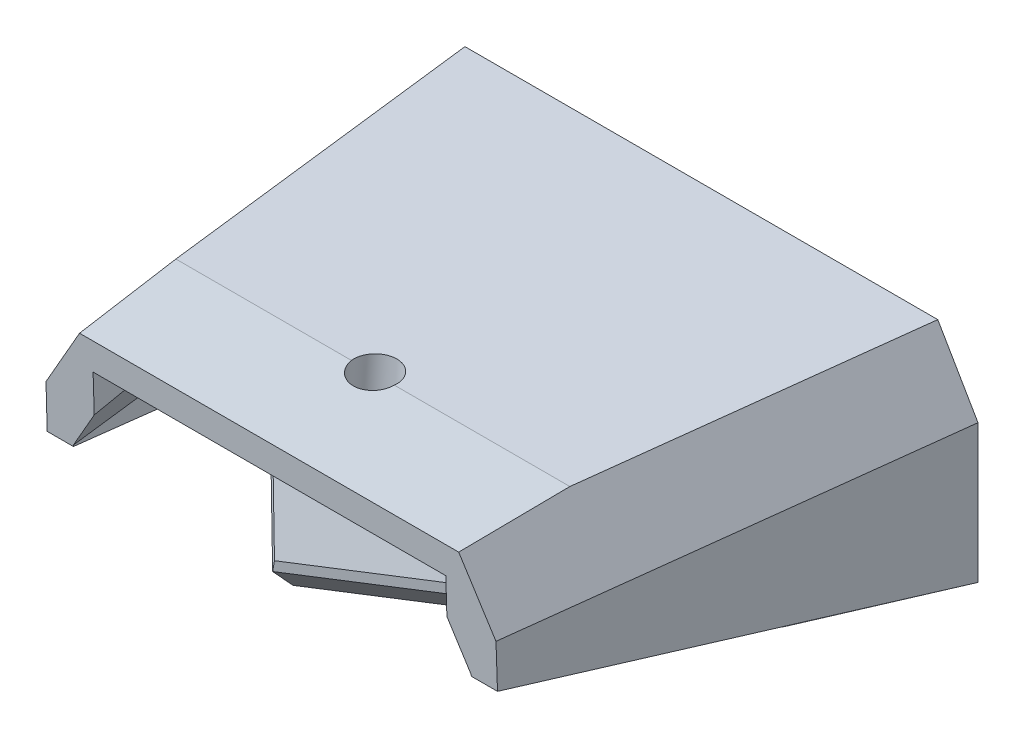
ISO-10303-21;
HEADER;
FILE_DESCRIPTION(('STEP AP214'),'2;1');
FILE_NAME('part.step','',(''),(''),'','','');
FILE_SCHEMA(('AUTOMOTIVE_DESIGN { 1 0 10303 214 1 1 1 1 }'));
ENDSEC;
DATA;
#1=APPLICATION_CONTEXT('core data for automotive mechanical design processes');
#2=APPLICATION_PROTOCOL_DEFINITION('international standard','automotive_design',2000,#1);
#3=PRODUCT_CONTEXT('',#1,'mechanical');
#4=PRODUCT('Part','Part','',(#3));
#5=PRODUCT_RELATED_PRODUCT_CATEGORY('part','',(#4));
#6=PRODUCT_DEFINITION_FORMATION('','',#4);
#7=PRODUCT_DEFINITION_CONTEXT('part definition',#1,'design');
#8=PRODUCT_DEFINITION('design','',#6,#7);
#9=PRODUCT_DEFINITION_SHAPE('','',#8);
#10=(LENGTH_UNIT() NAMED_UNIT(*) SI_UNIT(.MILLI.,.METRE.));
#11=(NAMED_UNIT(*) PLANE_ANGLE_UNIT() SI_UNIT($,.RADIAN.));
#12=(NAMED_UNIT(*) SI_UNIT($,.STERADIAN.) SOLID_ANGLE_UNIT());
#13=UNCERTAINTY_MEASURE_WITH_UNIT(LENGTH_MEASURE(1.E-05),#10,'distance_accuracy_value','');
#14=(GEOMETRIC_REPRESENTATION_CONTEXT(3) GLOBAL_UNCERTAINTY_ASSIGNED_CONTEXT((#13)) GLOBAL_UNIT_ASSIGNED_CONTEXT((#10,
#11,#12)) REPRESENTATION_CONTEXT('',''));
#15=CARTESIAN_POINT('',(0.,0.,0.));
#16=DIRECTION('',(0.,0.,1.));
#17=DIRECTION('',(1.,0.,0.));
#18=AXIS2_PLACEMENT_3D('',#15,#16,#17);
#19=CARTESIAN_POINT('',(0.,0.,0.));
#20=DIRECTION('',(0.,1.,0.));
#21=DIRECTION('',(0.,0.,1.));
#22=AXIS2_PLACEMENT_3D('',#19,#20,#21);
#23=PLANE('',#22);
#24=DIRECTION('',(-0.119145220618431,0.,-0.992876838486922));
#25=VECTOR('',#24,1.);
#26=CARTESIAN_POINT('',(0.502534808185643,0.,-25.2382904412369));
#27=LINE('',#26,#25);
#28=CARTESIAN_POINT('',(2.76887033886593,0.,-6.35216101890115));
#29=VERTEX_POINT('',#28);
#30=CARTESIAN_POINT('',(2.53112966113409,0.,-8.33333333333314));
#31=VERTEX_POINT('',#30);
#32=EDGE_CURVE('E489',#29,#31,#27,.T.);
#33=ORIENTED_EDGE('',*,*,#32,.T.);
#34=DIRECTION('',(1.,0.,0.));
#35=VECTOR('',#34,1.);
#36=CARTESIAN_POINT('',(-17.3629163817419,0.,-8.33333333333314));
#37=LINE('',#36,#35);
#38=CARTESIAN_POINT('',(2.76887033886593,0.,-8.33333333333314));
#39=VERTEX_POINT('',#38);
#40=EDGE_CURVE('E314',#31,#39,#37,.T.);
#41=ORIENTED_EDGE('',*,*,#40,.T.);
#42=DIRECTION('',(0.,0.,-1.));
#43=VECTOR('',#42,1.);
#44=CARTESIAN_POINT('',(2.76887033886593,0.,0.));
#45=LINE('',#44,#43);
#46=EDGE_CURVE('E338',#29,#39,#45,.T.);
#47=ORIENTED_EDGE('',*,*,#46,.F.);
#48=EDGE_LOOP('',(#33,#41,#47));
#49=FACE_BOUND('',#48,.T.);
#50=ADVANCED_FACE('F78',(#49),#23,.F.);
#51=CARTESIAN_POINT('',(1.5167811312118,-3.46410161513779,0.));
#52=DIRECTION('',(0.859856564958856,-0.499999999999995,-0.103182787795063));
#53=DIRECTION('',(-0.119145220618431,0.,-0.992876838486922));
#54=AXIS2_PLACEMENT_3D('',#51,#52,#53);
#55=PLANE('',#54);
#56=DIRECTION('',(0.,-0.202106905399812,0.979363466129767));
#57=VECTOR('',#56,1.);
#58=CARTESIAN_POINT('',(2.76887033886593,-1.39882095757878,0.426202831652322));
#59=LINE('',#58,#57);
#60=CARTESIAN_POINT('',(2.76887033886593,-1.2867578238557,-0.116829277276788));
#61=VERTEX_POINT('',#60);
#62=EDGE_CURVE('E474',#61,#29,#59,.F.);
#63=ORIENTED_EDGE('',*,*,#62,.F.);
#64=DIRECTION('',(0.504890138740269,0.862773094436703,0.0266183267495743));
#65=VECTOR('',#64,1.);
#66=CARTESIAN_POINT('',(1.50280210436019,-3.45025741443586,-0.183577695135405));
#67=LINE('',#66,#65);
#68=CARTESIAN_POINT('',(1.49470055314328,-3.46410161513779,-0.184004817237667));
#69=VERTEX_POINT('',#68);
#70=EDGE_CURVE('E915',#61,#69,#67,.F.);
#71=ORIENTED_EDGE('',*,*,#70,.T.);
#72=DIRECTION('',(0.119145220618431,0.,0.992876838486922));
#73=VECTOR('',#72,1.);
#74=CARTESIAN_POINT('',(1.5167811312118,-3.46410161513779,0.));
#75=LINE('',#74,#73);
#76=CARTESIAN_POINT('',(-1.4832188687882,-3.46410161513779,-25.));
#77=VERTEX_POINT('',#76);
#78=EDGE_CURVE('E411',#77,#69,#75,.T.);
#79=ORIENTED_EDGE('',*,*,#78,.F.);
#80=DIRECTION('',(0.502683115756314,0.864470754354087,0.));
#81=VECTOR('',#80,1.);
#82=CARTESIAN_POINT('',(4.98555698992813,7.66033716359151,-25.));
#83=LINE('',#82,#81);
#84=CARTESIAN_POINT('',(1.40336816062832,1.5,-25.));
#85=VERTEX_POINT('',#84);
#86=EDGE_CURVE('E496',#85,#77,#83,.F.);
#87=ORIENTED_EDGE('',*,*,#86,.F.);
#88=DIRECTION('',(-0.0672407716782115,0.0894348295025887,-0.993720327806552));
#89=VECTOR('',#88,1.);
#90=CARTESIAN_POINT('',(1.31851975718103,1.6128541851392,-26.2539353904355));
#91=LINE('',#90,#89);
#92=EDGE_CURVE('E311',#85,#31,#91,.F.);
#93=ORIENTED_EDGE('',*,*,#92,.T.);
#94=ORIENTED_EDGE('',*,*,#32,.F.);
#95=EDGE_LOOP('',(#63,#71,#79,#87,#93,#94));
#96=FACE_BOUND('',#95,.T.);
#97=ADVANCED_FACE('F606',(#96),#55,.T.);
#98=CARTESIAN_POINT('',(0.,-3.33842045020984,0.734452499046166));
#99=DIRECTION('',(0.,0.97664446670509,-0.21486178267512));
#100=DIRECTION('',(0.,0.21486178267512,0.97664446670509));
#101=AXIS2_PLACEMENT_3D('',#98,#99,#100);
#102=PLANE('',#101);
#103=DIRECTION('',(-0.114039713010586,-0.21346006563523,-0.97027302561468));
#104=VECTOR('',#103,1.);
#105=CARTESIAN_POINT('',(-3.,-9.,-25.));
#106=LINE('',#105,#104);
#107=CARTESIAN_POINT('',(-1.81620359026515,-6.78416437002702,-14.9280198637592));
#108=VERTEX_POINT('',#107);
#109=CARTESIAN_POINT('',(-3.,-9.,-25.));
#110=VERTEX_POINT('',#109);
#111=EDGE_CURVE('E383',#108,#110,#106,.T.);
#112=ORIENTED_EDGE('',*,*,#111,.F.);
#113=DIRECTION('',(-0.703496414382695,-0.152702012719811,-0.694100057817323));
#114=VECTOR('',#113,1.);
#115=CARTESIAN_POINT('',(7.10074552097474,-4.84863769388713,-6.13017133585061));
#116=LINE('',#115,#114);
#117=CARTESIAN_POINT('',(-1.78802626747906,-6.77804815704494,-14.9002188956588));
#118=VERTEX_POINT('',#117);
#119=EDGE_CURVE('E347',#118,#108,#116,.T.);
#120=ORIENTED_EDGE('',*,*,#119,.F.);
#121=DIRECTION('',(-0.116400668141753,-0.213401224926547,-0.970005567847939));
#122=VECTOR('',#121,1.);
#123=CARTESIAN_POINT('',(-2.70191945803538,-8.4535190063982,-22.5159954836281));
#124=LINE('',#123,#122);
#125=EDGE_CURVE('E396',#118,#110,#124,.T.);
#126=ORIENTED_EDGE('',*,*,#125,.T.);
#127=EDGE_LOOP('',(#112,#120,#126));
#128=FACE_BOUND('',#127,.T.);
#129=ADVANCED_FACE('F582',(#128),#102,.T.);
#130=DIRECTION('',(0.699841488267646,-0.153475380519136,-0.697615365996072));
#131=VECTOR('',#130,1.);
#132=CARTESIAN_POINT('',(6.09842939222965,-2.05462061566197,6.5699062924456));
#133=LINE('',#132,#131);
#134=CARTESIAN_POINT('',(27.8085372830385,-6.81565168557063,-15.0711440253211));
#135=VERTEX_POINT('',#134);
#136=CARTESIAN_POINT('',(27.836275268888,-6.82173463150118,-15.0987937795508));
#137=VERTEX_POINT('',#136);
#138=EDGE_CURVE('E345',#135,#137,#133,.T.);
#139=ORIENTED_EDGE('',*,*,#138,.T.);
#140=DIRECTION('',(-0.114039713010586,0.21346006563523,0.97027302561468));
#141=VECTOR('',#140,1.);
#142=CARTESIAN_POINT('',(26.,-3.38458603586418,0.524608927890113));
#143=LINE('',#142,#141);
#144=CARTESIAN_POINT('',(29.,-9.,-25.));
#145=VERTEX_POINT('',#144);
#146=EDGE_CURVE('E375',#145,#137,#143,.T.);
#147=ORIENTED_EDGE('',*,*,#146,.F.);
#148=DIRECTION('',(-0.116400668141753,0.213401224926547,0.970005567847939));
#149=VECTOR('',#148,1.);
#150=CARTESIAN_POINT('',(28.7019194580354,-8.4535190063982,-22.5159954836282));
#151=LINE('',#150,#149);
#152=EDGE_CURVE('E393',#145,#135,#151,.T.);
#153=ORIENTED_EDGE('',*,*,#152,.T.);
#154=EDGE_LOOP('',(#139,#147,#153));
#155=FACE_BOUND('',#154,.T.);
#156=ADVANCED_FACE('F531',(#155),#102,.T.);
#157=CARTESIAN_POINT('',(13.,-3.56813645169676,-0.309711144076167));
#158=VERTEX_POINT('',#157);
#159=CARTESIAN_POINT('',(24.3245404404983,-6.05161047038072,-11.5982294108215));
#160=VERTEX_POINT('',#159);
#161=EDGE_CURVE('E348',#158,#160,#133,.T.);
#162=ORIENTED_EDGE('',*,*,#161,.T.);
#163=DIRECTION('',(0.116400668141753,-0.213401224926547,-0.970005567847939));
#164=VECTOR('',#163,1.);
#165=CARTESIAN_POINT('',(22.5350942341944,-2.77095909215688,3.31382230837784));
#166=LINE('',#165,#164);
#167=CARTESIAN_POINT('',(25.7421778869917,-8.65061245561866,-23.4118747982666));
#168=VERTEX_POINT('',#167);
#169=EDGE_CURVE('E421',#160,#168,#166,.T.);
#170=ORIENTED_EDGE('',*,*,#169,.T.);
#171=DIRECTION('',(-0.699841488267646,0.153475380519136,0.697615365996072));
#172=VECTOR('',#171,1.);
#173=CARTESIAN_POINT('',(0.774924275915627,-3.17528866770938,1.47596060132098));
#174=LINE('',#173,#172);
#175=CARTESIAN_POINT('',(13.,-5.85625025698794,-10.7102284408543));
#176=VERTEX_POINT('',#175);
#177=EDGE_CURVE('E365',#168,#176,#174,.T.);
#178=ORIENTED_EDGE('',*,*,#177,.T.);
#179=DIRECTION('',(0.703496414382695,0.152702012719811,0.694100057817323));
#180=VECTOR('',#179,1.);
#181=CARTESIAN_POINT('',(12.4250872492295,-5.98104170209853,-11.277462282266));
#182=LINE('',#181,#180);
#183=CARTESIAN_POINT('',(-1.4832188687882,-9.,-25.));
#184=VERTEX_POINT('',#183);
#185=EDGE_CURVE('E362',#184,#176,#182,.T.);
#186=ORIENTED_EDGE('',*,*,#185,.F.);
#187=DIRECTION('',(0.116400668141753,0.213401224926547,0.970005567847939));
#188=VECTOR('',#187,1.);
#189=CARTESIAN_POINT('',(1.29322072473834,-3.90986074520135,-1.86300338727889));
#190=LINE('',#189,#188);
#191=CARTESIAN_POINT('',(-0.0675449642143444,-6.4045978416146,-13.2027174618846));
#192=VERTEX_POINT('',#191);
#193=EDGE_CURVE('E390',#184,#192,#190,.T.);
#194=ORIENTED_EDGE('',*,*,#193,.T.);
#195=EDGE_CURVE('E342',#158,#192,#116,.T.);
#196=ORIENTED_EDGE('',*,*,#195,.F.);
#197=EDGE_LOOP('',(#162,#170,#178,#186,#194,#196));
#198=FACE_BOUND('',#197,.T.);
#199=ADVANCED_FACE('F559',(#198),#102,.T.);
#200=CARTESIAN_POINT('',(29.,-10.4649667000576,-24.6777073259873));
#201=DIRECTION('',(0.,0.21486178267512,0.97664446670509));
#202=DIRECTION('',(0.,-0.97664446670509,0.21486178267512));
#203=AXIS2_PLACEMENT_3D('',#200,#201,#202);
#204=PLANE('',#203);
#205=DIRECTION('',(0.,-0.97664446670509,0.21486178267512));
#206=VECTOR('',#205,1.);
#207=CARTESIAN_POINT('',(-1.4832188687882,-9.,-25.));
#208=LINE('',#207,#206);
#209=CARTESIAN_POINT('',(-1.4832188687882,-9.84968166692628,-24.8130700332762));
#210=VERTEX_POINT('',#209);
#211=EDGE_CURVE('E368',#184,#210,#208,.T.);
#212=ORIENTED_EDGE('',*,*,#211,.T.);
#213=DIRECTION('',(0.867436684678202,-0.485927094571341,0.106903960805695));
#214=VECTOR('',#213,1.);
#215=CARTESIAN_POINT('',(1.86520211081921,-11.7254248845721,-24.4004065253941));
#216=LINE('',#215,#214);
#217=EDGE_CURVE('E446',#210,#110,#216,.F.);
#218=ORIENTED_EDGE('',*,*,#217,.T.);
#219=DIRECTION('',(1.,0.,0.));
#220=VECTOR('',#219,1.);
#221=CARTESIAN_POINT('',(-3.,-9.,-25.));
#222=LINE('',#221,#220);
#223=EDGE_CURVE('E387',#110,#184,#222,.T.);
#224=ORIENTED_EDGE('',*,*,#223,.T.);
#225=EDGE_LOOP('',(#212,#218,#224));
#226=FACE_BOUND('',#225,.T.);
#227=ADVANCED_FACE('F633',(#226),#204,.F.);
#228=CARTESIAN_POINT('',(0.,-4.80338715026748,1.05674517305885));
#229=DIRECTION('',(0.,0.97664446670509,-0.21486178267512));
#230=DIRECTION('',(0.,0.21486178267512,0.97664446670509));
#231=AXIS2_PLACEMENT_3D('',#228,#229,#230);
#232=PLANE('',#231);
#233=DIRECTION('',(-0.699841488267646,0.153475380519136,0.697615365996071));
#234=VECTOR('',#233,1.);
#235=CARTESIAN_POINT('',(5.38413121128605,-3.6699565054788,6.20870264937103));
#236=LINE('',#235,#234);
#237=CARTESIAN_POINT('',(25.0598770441155,-7.98485156288133,-13.4044567024586));
#238=VERTEX_POINT('',#237);
#239=CARTESIAN_POINT('',(12.9963446451858,-5.33931645761962,-1.37929713308725));
#240=VERTEX_POINT('',#239);
#241=EDGE_CURVE('E457',#238,#240,#236,.T.);
#242=ORIENTED_EDGE('',*,*,#241,.T.);
#243=DIRECTION('',(-0.703496414382695,-0.152702012719811,-0.694100057817323));
#244=VECTOR('',#243,1.);
#245=CARTESIAN_POINT('',(1.85267361861976,-7.75817881434855,-12.3741260273096));
#246=LINE('',#245,#244);
#247=CARTESIAN_POINT('',(0.957402435166903,-7.95250775312965,-13.2574393854056));
#248=VERTEX_POINT('',#247);
#249=EDGE_CURVE('E459',#240,#248,#246,.T.);
#250=ORIENTED_EDGE('',*,*,#249,.T.);
#251=DIRECTION('',(-0.114039713010586,-0.21346006563523,-0.970273025614681));
#252=VECTOR('',#251,1.);
#253=CARTESIAN_POINT('',(2.60546978532506,-4.86764761582482,0.764652147798188));
#254=LINE('',#253,#252);
#255=CARTESIAN_POINT('',(-0.24078592089493,-10.1952822952278,-23.4518691222154));
#256=VERTEX_POINT('',#255);
#257=EDGE_CURVE('E442',#248,#256,#254,.T.);
#258=ORIENTED_EDGE('',*,*,#257,.T.);
#259=DIRECTION('',(0.703496414382695,0.152702012719811,0.694100057817323));
#260=VECTOR('',#259,1.);
#261=CARTESIAN_POINT('',(12.4250872492295,-7.44600840215616,-10.9551696082534));
#262=LINE('',#261,#260);
#263=CARTESIAN_POINT('',(13.,-7.32121695704558,-10.3879357668416));
#264=VERTEX_POINT('',#263);
#265=EDGE_CURVE('E361',#256,#264,#262,.T.);
#266=ORIENTED_EDGE('',*,*,#265,.T.);
#267=DIRECTION('',(-0.699841488267646,0.153475380519136,0.697615365996072));
#268=VECTOR('',#267,1.);
#269=CARTESIAN_POINT('',(0.774924275915627,-4.64025536776702,1.79825327533366));
#270=LINE('',#269,#268);
#271=CARTESIAN_POINT('',(26.2587233633781,-10.2288576835613,-23.6044845237314));
#272=VERTEX_POINT('',#271);
#273=EDGE_CURVE('E366',#272,#264,#270,.T.);
#274=ORIENTED_EDGE('',*,*,#273,.F.);
#275=DIRECTION('',(-0.114039713010586,0.21346006563523,0.970273025614681));
#276=VECTOR('',#275,1.);
#277=CARTESIAN_POINT('',(23.056398754943,-4.234731575594,3.64154323975649));
#278=LINE('',#277,#276);
#279=EDGE_CURVE('E439',#272,#238,#278,.T.);
#280=ORIENTED_EDGE('',*,*,#279,.T.);
#281=EDGE_LOOP('',(#242,#250,#258,#266,#274,#280));
#282=FACE_BOUND('',#281,.T.);
#283=ADVANCED_FACE('F593',(#282),#232,.F.);
#284=CARTESIAN_POINT('',(-3.,3.,-25.));
#285=DIRECTION('',(0.992876838486922,0.,-0.119145220618431));
#286=DIRECTION('',(-0.119145220618431,0.,-0.992876838486922));
#287=AXIS2_PLACEMENT_3D('',#284,#285,#286);
#288=PLANE('',#287);
#289=CARTESIAN_POINT('',(-0.0223652860903739,-3.54100302449902,-0.186377384086446));
#290=VERTEX_POINT('',#289);
#291=EDGE_CURVE('E397',#290,#118,#124,.T.);
#292=ORIENTED_EDGE('',*,*,#291,.F.);
#293=DIRECTION('',(0.00370046105626031,0.999517571229778,0.0308371754688359));
#294=VECTOR('',#293,1.);
#295=CARTESIAN_POINT('',(-0.00104453648508288,2.21786419185145,-0.00870447070901864));
#296=LINE('',#295,#294);
#297=CARTESIAN_POINT('',(-0.0129578649437614,-1.00000000000002,-0.107982207864673));
#298=VERTEX_POINT('',#297);
#299=EDGE_CURVE('E300',#290,#298,#296,.T.);
#300=ORIENTED_EDGE('',*,*,#299,.T.);
#301=DIRECTION('',(-0.119145220618431,0.,-0.992876838486922));
#302=VECTOR('',#301,1.);
#303=CARTESIAN_POINT('',(-3.,-1.00000000000002,-25.));
#304=LINE('',#303,#302);
#305=CARTESIAN_POINT('',(-3.,-1.00000000000002,-25.));
#306=VERTEX_POINT('',#305);
#307=EDGE_CURVE('E299',#298,#306,#304,.T.);
#308=ORIENTED_EDGE('',*,*,#307,.T.);
#309=DIRECTION('',(0.,-1.,0.));
#310=VECTOR('',#309,1.);
#311=CARTESIAN_POINT('',(-3.,3.,-25.));
#312=LINE('',#311,#310);
#313=EDGE_CURVE('E406',#306,#110,#312,.T.);
#314=ORIENTED_EDGE('',*,*,#313,.T.);
#315=ORIENTED_EDGE('',*,*,#125,.F.);
#316=EDGE_LOOP('',(#292,#300,#308,#314,#315));
#317=FACE_BOUND('',#316,.T.);
#318=ADVANCED_FACE('F638',(#317),#288,.F.);
#319=CARTESIAN_POINT('',(29.,3.,-25.));
#320=DIRECTION('',(-0.992876838486922,0.,-0.119145220618431));
#321=DIRECTION('',(-0.119145220618431,0.,0.992876838486922));
#322=AXIS2_PLACEMENT_3D('',#319,#320,#321);
#323=PLANE('',#322);
#324=DIRECTION('',(-0.119145220618431,0.,0.992876838486922));
#325=VECTOR('',#324,1.);
#326=CARTESIAN_POINT('',(26.,-1.00000000000002,0.));
#327=LINE('',#326,#325);
#328=CARTESIAN_POINT('',(29.,-1.00000000000002,-25.));
#329=VERTEX_POINT('',#328);
#330=CARTESIAN_POINT('',(26.0129578649438,-1.00000000000002,-0.107982207864673));
#331=VERTEX_POINT('',#330);
#332=EDGE_CURVE('E508',#329,#331,#327,.T.);
#333=ORIENTED_EDGE('',*,*,#332,.T.);
#334=DIRECTION('',(0.00370046105626031,-0.999517571229778,-0.0308371754688359));
#335=VECTOR('',#334,1.);
#336=CARTESIAN_POINT('',(26.0010445364851,2.21786419185145,-0.00870447070901864));
#337=LINE('',#336,#335);
#338=CARTESIAN_POINT('',(26.0223652860904,-3.54100302449902,-0.186377384086444));
#339=VERTEX_POINT('',#338);
#340=EDGE_CURVE('E918',#331,#339,#337,.T.);
#341=ORIENTED_EDGE('',*,*,#340,.T.);
#342=DIRECTION('',(-0.116400668141753,0.213401224926547,0.970005567847939));
#343=VECTOR('',#342,1.);
#344=CARTESIAN_POINT('',(28.7019194580354,-8.45351900639819,-22.5159954836282));
#345=LINE('',#344,#343);
#346=EDGE_CURVE('E355',#135,#339,#345,.T.);
#347=ORIENTED_EDGE('',*,*,#346,.F.);
#348=ORIENTED_EDGE('',*,*,#152,.F.);
#349=DIRECTION('',(0.,-1.,0.));
#350=VECTOR('',#349,1.);
#351=CARTESIAN_POINT('',(29.,3.,-25.));
#352=LINE('',#351,#350);
#353=EDGE_CURVE('E409',#329,#145,#352,.T.);
#354=ORIENTED_EDGE('',*,*,#353,.F.);
#355=EDGE_LOOP('',(#333,#341,#347,#348,#354));
#356=FACE_BOUND('',#355,.T.);
#357=ADVANCED_FACE('F718',(#356),#323,.F.);
#358=CARTESIAN_POINT('',(13.,3.,-25.));
#359=DIRECTION('',(0.,0.,1.));
#360=DIRECTION('',(1.,0.,0.));
#361=AXIS2_PLACEMENT_3D('',#358,#359,#360);
#362=PLANE('',#361);
#363=DIRECTION('',(1.,0.,0.));
#364=VECTOR('',#363,1.);
#365=CARTESIAN_POINT('',(-17.3629163817419,1.5,-25.));
#366=LINE('',#365,#364);
#367=CARTESIAN_POINT('',(24.5966318393717,1.5,-25.));
#368=VERTEX_POINT('',#367);
#369=EDGE_CURVE('E317',#85,#368,#366,.T.);
#370=ORIENTED_EDGE('',*,*,#369,.F.);
#371=ORIENTED_EDGE('',*,*,#86,.T.);
#372=DIRECTION('',(0.,1.,0.));
#373=VECTOR('',#372,1.);
#374=CARTESIAN_POINT('',(-1.4832188687882,-12.5,-25.));
#375=LINE('',#374,#373);
#376=EDGE_CURVE('E402',#184,#77,#375,.T.);
#377=ORIENTED_EDGE('',*,*,#376,.F.);
#378=ORIENTED_EDGE('',*,*,#223,.F.);
#379=ORIENTED_EDGE('',*,*,#313,.F.);
#380=DIRECTION('',(0.502683115756316,0.864470754354086,0.));
#381=VECTOR('',#380,1.);
#382=CARTESIAN_POINT('',(0.0756968234203663,4.28931621088221,-25.));
#383=LINE('',#382,#381);
#384=CARTESIAN_POINT('',(-0.674030668015314,3.,-25.));
#385=VERTEX_POINT('',#384);
#386=EDGE_CURVE('E504',#306,#385,#383,.T.);
#387=ORIENTED_EDGE('',*,*,#386,.T.);
#388=DIRECTION('',(-1.,0.,0.));
#389=VECTOR('',#388,1.);
#390=CARTESIAN_POINT('',(13.,3.,-25.));
#391=LINE('',#390,#389);
#392=CARTESIAN_POINT('',(26.6740306680153,3.,-25.));
#393=VERTEX_POINT('',#392);
#394=EDGE_CURVE('E403',#393,#385,#391,.T.);
#395=ORIENTED_EDGE('',*,*,#394,.F.);
#396=DIRECTION('',(0.502683115756315,-0.864470754354087,0.));
#397=VECTOR('',#396,1.);
#398=CARTESIAN_POINT('',(25.831038927875,4.44970396393153,-25.));
#399=LINE('',#398,#397);
#400=EDGE_CURVE('E506',#393,#329,#399,.T.);
#401=ORIENTED_EDGE('',*,*,#400,.T.);
#402=ORIENTED_EDGE('',*,*,#353,.T.);
#403=CARTESIAN_POINT('',(27.3353708682695,-9.,-25.));
#404=VERTEX_POINT('',#403);
#405=EDGE_CURVE('E386',#404,#145,#222,.T.);
#406=ORIENTED_EDGE('',*,*,#405,.F.);
#407=DIRECTION('',(-0.205998183289691,0.978552373908186,0.));
#408=VECTOR('',#407,1.);
#409=CARTESIAN_POINT('',(24.3080856645145,5.38050120308915,-25.));
#410=LINE('',#409,#408);
#411=CARTESIAN_POINT('',(27.0934154004732,-7.85063987647329,-25.));
#412=VERTEX_POINT('',#411);
#413=EDGE_CURVE('E436',#404,#412,#410,.T.);
#414=ORIENTED_EDGE('',*,*,#413,.T.);
#415=DIRECTION('',(0.710557973710907,0.703638661527243,0.));
#416=VECTOR('',#415,1.);
#417=CARTESIAN_POINT('',(25.4028139676527,-9.52477847371299,-25.));
#418=LINE('',#417,#416);
#419=CARTESIAN_POINT('',(27.4832188687882,-7.4646322587255,-25.));
#420=VERTEX_POINT('',#419);
#421=EDGE_CURVE('E432',#412,#420,#418,.T.);
#422=ORIENTED_EDGE('',*,*,#421,.T.);
#423=DIRECTION('',(0.,1.,0.));
#424=VECTOR('',#423,1.);
#425=CARTESIAN_POINT('',(27.4832188687882,-12.5,-25.));
#426=LINE('',#425,#424);
#427=CARTESIAN_POINT('',(27.4832188687882,-3.46410161513779,-25.));
#428=VERTEX_POINT('',#427);
#429=EDGE_CURVE('E399',#420,#428,#426,.T.);
#430=ORIENTED_EDGE('',*,*,#429,.T.);
#431=DIRECTION('',(0.502683115756313,-0.864470754354088,0.));
#432=VECTOR('',#431,1.);
#433=CARTESIAN_POINT('',(21.0144430100719,7.66033716359151,-25.));
#434=LINE('',#433,#432);
#435=EDGE_CURVE('E498',#428,#368,#434,.F.);
#436=ORIENTED_EDGE('',*,*,#435,.T.);
#437=EDGE_LOOP('',(#370,#371,#377,#378,#379,#387,#395,#401,#402,#406,#414,#422,#430,#436));
#438=FACE_BOUND('',#437,.T.);
#439=ADVANCED_FACE('F552',(#438),#362,.F.);
#440=CARTESIAN_POINT('',(1.5167811312118,-12.5,0.));
#441=DIRECTION('',(-0.992876838486922,0.,0.119145220618431));
#442=DIRECTION('',(0.119145220618431,0.,0.992876838486922));
#443=AXIS2_PLACEMENT_3D('',#440,#441,#442);
#444=PLANE('',#443);
#445=ORIENTED_EDGE('',*,*,#78,.T.);
#446=DIRECTION('',(-0.00370046105626031,-0.999517571229778,-0.0308371754688359));
#447=VECTOR('',#446,1.);
#448=CARTESIAN_POINT('',(1.46130099350105,-12.4855306279561,-0.462334480922961));
#449=LINE('',#448,#447);
#450=CARTESIAN_POINT('',(1.49441584512143,-3.54100302449902,-0.186377384086447));
#451=VERTEX_POINT('',#450);
#452=EDGE_CURVE('E570',#69,#451,#449,.T.);
#453=ORIENTED_EDGE('',*,*,#452,.T.);
#454=DIRECTION('',(0.116400668141753,0.213401224926547,0.970005567847939));
#455=VECTOR('',#454,1.);
#456=CARTESIAN_POINT('',(1.29322072473834,-3.90986074520135,-1.86300338727889));
#457=LINE('',#456,#455);
#458=EDGE_CURVE('E358',#192,#451,#457,.T.);
#459=ORIENTED_EDGE('',*,*,#458,.F.);
#460=ORIENTED_EDGE('',*,*,#193,.F.);
#461=ORIENTED_EDGE('',*,*,#376,.T.);
#462=EDGE_LOOP('',(#445,#453,#459,#460,#461));
#463=FACE_BOUND('',#462,.T.);
#464=ADVANCED_FACE('F569',(#463),#444,.F.);
#465=CARTESIAN_POINT('',(24.4832188687882,-12.5,0.));
#466=DIRECTION('',(0.992876838486922,0.,0.119145220618431));
#467=DIRECTION('',(0.119145220618431,0.,-0.992876838486922));
#468=AXIS2_PLACEMENT_3D('',#465,#466,#467);
#469=PLANE('',#468);
#470=DIRECTION('',(0.116400668141753,-0.213401224926547,-0.970005567847939));
#471=VECTOR('',#470,1.);
#472=CARTESIAN_POINT('',(24.7067792752617,-3.90986074520135,-1.86300338727889));
#473=LINE('',#472,#471);
#474=CARTESIAN_POINT('',(24.5055841548786,-3.54100302449902,-0.186377384086447));
#475=VERTEX_POINT('',#474);
#476=CARTESIAN_POINT('',(26.0856696695156,-6.43782646800021,-13.3537566727282));
#477=VERTEX_POINT('',#476);
#478=EDGE_CURVE('E419',#475,#477,#473,.T.);
#479=ORIENTED_EDGE('',*,*,#478,.F.);
#480=DIRECTION('',(-0.00370046105626031,0.999517571229778,0.0308371754688359));
#481=VECTOR('',#480,1.);
#482=CARTESIAN_POINT('',(24.5386990064989,-12.4855306279561,-0.462334480922961));
#483=LINE('',#482,#481);
#484=CARTESIAN_POINT('',(24.5052994468567,-3.46410161513779,-0.184004817237667));
#485=VERTEX_POINT('',#484);
#486=EDGE_CURVE('E945',#475,#485,#483,.T.);
#487=ORIENTED_EDGE('',*,*,#486,.T.);
#488=DIRECTION('',(0.119145220618431,0.,-0.992876838486922));
#489=VECTOR('',#488,1.);
#490=CARTESIAN_POINT('',(27.4832188687882,-3.46410161513779,-25.));
#491=LINE('',#490,#489);
#492=EDGE_CURVE('E491',#485,#428,#491,.T.);
#493=ORIENTED_EDGE('',*,*,#492,.T.);
#494=ORIENTED_EDGE('',*,*,#429,.F.);
#495=DIRECTION('',(-0.116400668141753,0.213401224926547,0.970005567847939));
#496=VECTOR('',#495,1.);
#497=CARTESIAN_POINT('',(24.7449178792978,-2.44441377799318,-2.18082508758035));
#498=LINE('',#497,#496);
#499=CARTESIAN_POINT('',(26.1295852184862,-4.98297056650519,-13.7197195808168));
#500=VERTEX_POINT('',#499);
#501=EDGE_CURVE('E427',#420,#500,#498,.T.);
#502=ORIENTED_EDGE('',*,*,#501,.T.);
#503=DIRECTION('',(-0.0292610207179841,-0.969373483269102,0.243841839316534));
#504=VECTOR('',#503,1.);
#505=CARTESIAN_POINT('',(26.0507289047141,-7.59536130624469,-13.0625836327162));
#506=LINE('',#505,#504);
#507=EDGE_CURVE('E424',#500,#477,#506,.T.);
#508=ORIENTED_EDGE('',*,*,#507,.T.);
#509=EDGE_LOOP('',(#479,#487,#493,#494,#502,#508));
#510=FACE_BOUND('',#509,.T.);
#511=ADVANCED_FACE('F522',(#510),#469,.F.);
#512=DIRECTION('',(0.,0.,-1.));
#513=VECTOR('',#512,1.);
#514=CARTESIAN_POINT('',(23.1688703388659,0.,0.));
#515=LINE('',#514,#513);
#516=CARTESIAN_POINT('',(23.1688703388659,0.,-5.83333333333326));
#517=VERTEX_POINT('',#516);
#518=CARTESIAN_POINT('',(23.1688703388659,0.,-8.33333333333314));
#519=VERTEX_POINT('',#518);
#520=EDGE_CURVE('E335',#517,#519,#515,.T.);
#521=ORIENTED_EDGE('',*,*,#520,.T.);
#522=CARTESIAN_POINT('',(23.4688703388659,0.,-8.33333333333314));
#523=VERTEX_POINT('',#522);
#524=EDGE_CURVE('E100',#519,#523,#37,.T.);
#525=ORIENTED_EDGE('',*,*,#524,.T.);
#526=DIRECTION('',(-0.119145220618431,0.,0.992876838486922));
#527=VECTOR('',#526,1.);
#528=CARTESIAN_POINT('',(22.4974651918144,0.,-0.23829044123686));
#529=LINE('',#528,#527);
#530=EDGE_CURVE('E486',#523,#517,#529,.T.);
#531=ORIENTED_EDGE('',*,*,#530,.T.);
#532=EDGE_LOOP('',(#521,#525,#531));
#533=FACE_BOUND('',#532,.T.);
#534=ADVANCED_FACE('F484',(#533),#23,.F.);
#535=CARTESIAN_POINT('',(0.,3.,0.));
#536=DIRECTION('',(0.,1.,0.));
#537=DIRECTION('',(0.,0.,1.));
#538=AXIS2_PLACEMENT_3D('',#535,#536,#537);
#539=PLANE('',#538);
#540=DIRECTION('',(-1.,0.,0.));
#541=VECTOR('',#540,1.);
#542=CARTESIAN_POINT('',(29.,3.,-6.));
#543=LINE('',#542,#541);
#544=CARTESIAN_POINT('',(24.3940306680153,3.,-6.));
#545=VERTEX_POINT('',#544);
#546=CARTESIAN_POINT('',(14.2431000180631,3.,-6.));
#547=VERTEX_POINT('',#546);
#548=EDGE_CURVE('E93',#545,#547,#543,.T.);
#549=ORIENTED_EDGE('',*,*,#548,.F.);
#550=DIRECTION('',(0.119145220618431,0.,-0.992876838486922));
#551=VECTOR('',#550,1.);
#552=CARTESIAN_POINT('',(26.7070491601097,3.,-25.2751541007868));
#553=LINE('',#552,#551);
#554=EDGE_CURVE('E502',#545,#393,#553,.T.);
#555=ORIENTED_EDGE('',*,*,#554,.T.);
#556=ORIENTED_EDGE('',*,*,#394,.T.);
#557=DIRECTION('',(0.119145220618431,0.,0.992876838486922));
#558=VECTOR('',#557,1.);
#559=CARTESIAN_POINT('',(2.29295083989027,3.,-0.275154100786832));
#560=LINE('',#559,#558);
#561=CARTESIAN_POINT('',(1.60596933198469,3.,-6.));
#562=VERTEX_POINT('',#561);
#563=EDGE_CURVE('E500',#385,#562,#560,.T.);
#564=ORIENTED_EDGE('',*,*,#563,.T.);
#565=CARTESIAN_POINT('',(11.7568999819369,3.,-6.));
#566=VERTEX_POINT('',#565);
#567=EDGE_CURVE('E289',#566,#562,#543,.T.);
#568=ORIENTED_EDGE('',*,*,#567,.F.);
#569=CARTESIAN_POINT('',(13.,3.,-6.13149723209449));
#570=DIRECTION('',(0.,1.,0.));
#571=DIRECTION('',(0.,0.,1.));
#572=AXIS2_PLACEMENT_3D('',#569,#570,#571);
#573=ELLIPSE('',#572,1.25323581180878,1.25);
#574=EDGE_CURVE('E328',#547,#566,#573,.T.);
#575=ORIENTED_EDGE('',*,*,#574,.F.);
#576=EDGE_LOOP('',(#549,#555,#556,#564,#568,#575));
#577=FACE_BOUND('',#576,.T.);
#578=ADVANCED_FACE('F617',(#577),#539,.T.);
#579=CARTESIAN_POINT('',(24.4832188687882,-3.46410161513779,0.));
#580=DIRECTION('',(-0.859856564958857,-0.499999999999994,-0.103182787795063));
#581=DIRECTION('',(-0.119145220618431,0.,0.992876838486922));
#582=AXIS2_PLACEMENT_3D('',#579,#580,#581);
#583=PLANE('',#582);
#584=ORIENTED_EDGE('',*,*,#492,.F.);
#585=DIRECTION('',(0.504890138740268,-0.862773094436704,-0.0266183267495743));
#586=VECTOR('',#585,1.);
#587=CARTESIAN_POINT('',(24.4971978956398,-3.45025741443586,-0.183577695135405));
#588=LINE('',#587,#586);
#589=CARTESIAN_POINT('',(23.1688703388659,-1.18036701918512,-0.113546901852551));
#590=VERTEX_POINT('',#589);
#591=EDGE_CURVE('E944',#485,#590,#588,.F.);
#592=ORIENTED_EDGE('',*,*,#591,.T.);
#593=DIRECTION('',(0.,-0.202106905399812,0.979363466129767));
#594=VECTOR('',#593,1.);
#595=CARTESIAN_POINT('',(23.1688703388659,-1.29612621885961,0.447395490518183));
#596=LINE('',#595,#594);
#597=EDGE_CURVE('E470',#590,#517,#596,.F.);
#598=ORIENTED_EDGE('',*,*,#597,.T.);
#599=ORIENTED_EDGE('',*,*,#530,.F.);
#600=DIRECTION('',(0.0672407716782117,0.0894348295025887,-0.993720327806552));
#601=VECTOR('',#600,1.);
#602=CARTESIAN_POINT('',(24.681480242819,1.6128541851392,-26.2539353904355));
#603=LINE('',#602,#601);
#604=EDGE_CURVE('E306',#368,#523,#603,.F.);
#605=ORIENTED_EDGE('',*,*,#604,.F.);
#606=ORIENTED_EDGE('',*,*,#435,.F.);
#607=EDGE_LOOP('',(#584,#592,#598,#599,#605,#606));
#608=FACE_BOUND('',#607,.T.);
#609=ADVANCED_FACE('F622',(#608),#583,.T.);
#610=CARTESIAN_POINT('',(23.3379639866082,3.,2.80055567839298));
#611=DIRECTION('',(0.859856564958856,0.499999999999996,0.103182787795063));
#612=DIRECTION('',(-0.119145220618431,0.,0.992876838486922));
#613=AXIS2_PLACEMENT_3D('',#610,#611,#612);
#614=PLANE('',#613);
#615=DIRECTION('',(-0.50489013874027,0.862773094436703,0.0266183267495743));
#616=VECTOR('',#615,1.);
#617=CARTESIAN_POINT('',(23.5495530239434,3.20954828474782,0.0218910258210458));
#618=LINE('',#617,#616);
#619=CARTESIAN_POINT('',(23.9647768345134,2.5,0.));
#620=VERTEX_POINT('',#619);
#621=EDGE_CURVE('E286',#331,#620,#618,.T.);
#622=ORIENTED_EDGE('',*,*,#621,.F.);
#623=ORIENTED_EDGE('',*,*,#332,.F.);
#624=ORIENTED_EDGE('',*,*,#400,.F.);
#625=ORIENTED_EDGE('',*,*,#554,.F.);
#626=DIRECTION('',(0.0711146722145461,0.0828352208696451,-0.994022650435741));
#627=VECTOR('',#626,1.);
#628=CARTESIAN_POINT('',(23.7665821092489,2.26914041320538,2.77031504153541));
#629=LINE('',#628,#627);
#630=EDGE_CURVE('E304',#620,#545,#629,.T.);
#631=ORIENTED_EDGE('',*,*,#630,.F.);
#632=EDGE_LOOP('',(#622,#623,#624,#625,#631));
#633=FACE_BOUND('',#632,.T.);
#634=ADVANCED_FACE('F739',(#633),#614,.T.);
#635=CARTESIAN_POINT('',(2.29295083989027,3.,-0.275154100786832));
#636=DIRECTION('',(-0.859856564958855,0.499999999999997,0.103182787795063));
#637=DIRECTION('',(-0.119145220618431,0.,-0.992876838486922));
#638=AXIS2_PLACEMENT_3D('',#635,#636,#637);
#639=PLANE('',#638);
#640=DIRECTION('',(-0.504890138740272,-0.862773094436702,-0.0266183267495743));
#641=VECTOR('',#640,1.);
#642=CARTESIAN_POINT('',(2.31502649805797,2.97813725908497,0.0147515191138163));
#643=LINE('',#642,#641);
#644=CARTESIAN_POINT('',(2.03522316548661,2.5,0.));
#645=VERTEX_POINT('',#644);
#646=EDGE_CURVE('E283',#645,#298,#643,.T.);
#647=ORIENTED_EDGE('',*,*,#646,.F.);
#648=DIRECTION('',(0.071114672214546,-0.0828352208696451,0.994022650435741));
#649=VECTOR('',#648,1.);
#650=CARTESIAN_POINT('',(2.0141306390531,2.52456882709868,-0.294825925184088));
#651=LINE('',#650,#649);
#652=EDGE_CURVE('E296',#562,#645,#651,.T.);
#653=ORIENTED_EDGE('',*,*,#652,.F.);
#654=ORIENTED_EDGE('',*,*,#563,.F.);
#655=ORIENTED_EDGE('',*,*,#386,.F.);
#656=ORIENTED_EDGE('',*,*,#307,.F.);
#657=EDGE_LOOP('',(#647,#653,#654,#655,#656));
#658=FACE_BOUND('',#657,.T.);
#659=ADVANCED_FACE('F294',(#658),#639,.T.);
#660=ORIENTED_EDGE('',*,*,#405,.T.);
#661=DIRECTION('',(0.8674366846782,0.485927094571343,-0.106903960805695));
#662=VECTOR('',#661,1.);
#663=CARTESIAN_POINT('',(23.8803720889277,-11.8679510102073,-24.3690507777544));
#664=LINE('',#663,#662);
#665=CARTESIAN_POINT('',(27.3353708682695,-9.93250425282706,-24.7948490643781));
#666=VERTEX_POINT('',#665);
#667=EDGE_CURVE('E453',#145,#666,#664,.F.);
#668=ORIENTED_EDGE('',*,*,#667,.T.);
#669=DIRECTION('',(0.,-0.97664446670509,0.21486178267512));
#670=VECTOR('',#669,1.);
#671=CARTESIAN_POINT('',(27.3353708682695,-9.,-25.));
#672=LINE('',#671,#670);
#673=EDGE_CURVE('E376',#404,#666,#672,.T.);
#674=ORIENTED_EDGE('',*,*,#673,.F.);
#675=EDGE_LOOP('',(#660,#668,#674));
#676=FACE_BOUND('',#675,.T.);
#677=ADVANCED_FACE('F543',(#676),#204,.F.);
#678=CARTESIAN_POINT('',(12.4250872492295,-5.98104170209853,-11.277462282266));
#679=DIRECTION('',(0.710698807478029,-0.151154493699821,-0.68706588045373));
#680=DIRECTION('',(-0.695051921941861,0.,-0.718959543927839));
#681=AXIS2_PLACEMENT_3D('',#678,#679,#680);
#682=PLANE('',#681);
#683=ORIENTED_EDGE('',*,*,#265,.F.);
#684=DIRECTION('',(0.662600529609285,-0.184311885590442,0.725940539570282));
#685=VECTOR('',#684,1.);
#686=CARTESIAN_POINT('',(10.6613616614727,-13.2278717485993,-11.5075519284371));
#687=LINE('',#686,#685);
#688=EDGE_CURVE('E444',#256,#210,#687,.F.);
#689=ORIENTED_EDGE('',*,*,#688,.T.);
#690=ORIENTED_EDGE('',*,*,#211,.F.);
#691=ORIENTED_EDGE('',*,*,#185,.T.);
#692=DIRECTION('',(0.,-0.97664446670509,0.21486178267512));
#693=VECTOR('',#692,1.);
#694=CARTESIAN_POINT('',(13.,-5.85625025698794,-10.7102284408543));
#695=LINE('',#694,#693);
#696=EDGE_CURVE('E372',#176,#264,#695,.T.);
#697=ORIENTED_EDGE('',*,*,#696,.T.);
#698=EDGE_LOOP('',(#683,#689,#690,#691,#697));
#699=FACE_BOUND('',#698,.T.);
#700=ADVANCED_FACE('F632',(#699),#682,.T.);
#701=CARTESIAN_POINT('',(0.774924275915627,-3.17528866770938,1.47596060132098));
#702=DIRECTION('',(0.714298180943593,0.150369189759195,0.683496317087252));
#703=DIRECTION('',(0.691357106878714,0.,-0.722513218403853));
#704=AXIS2_PLACEMENT_3D('',#701,#702,#703);
#705=PLANE('',#704);
#706=ORIENTED_EDGE('',*,*,#673,.T.);
#707=DIRECTION('',(0.659643744675152,0.181570742428453,-0.729316252119013));
#708=VECTOR('',#707,1.);
#709=CARTESIAN_POINT('',(12.4754631479003,-14.0227794945554,-8.36541682472101));
#710=LINE('',#709,#708);
#711=EDGE_CURVE('E455',#666,#272,#710,.F.);
#712=ORIENTED_EDGE('',*,*,#711,.T.);
#713=ORIENTED_EDGE('',*,*,#273,.T.);
#714=ORIENTED_EDGE('',*,*,#696,.F.);
#715=ORIENTED_EDGE('',*,*,#177,.F.);
#716=DIRECTION('',(0.605021847198011,0.35819083078537,-0.711089230093097));
#717=VECTOR('',#716,1.);
#718=CARTESIAN_POINT('',(7.08209720016401,-19.6979322089322,-1.48046443594176));
#719=LINE('',#718,#717);
#720=EDGE_CURVE('E430',#168,#412,#719,.T.);
#721=ORIENTED_EDGE('',*,*,#720,.T.);
#722=ORIENTED_EDGE('',*,*,#413,.F.);
#723=EDGE_LOOP('',(#706,#712,#713,#714,#715,#721,#722));
#724=FACE_BOUND('',#723,.T.);
#725=ADVANCED_FACE('F546',(#724),#705,.F.);
#726=CARTESIAN_POINT('',(0.,-3.33842045020984,0.734452499046165));
#727=DIRECTION('',(0.,-0.97664446670509,0.21486178267512));
#728=DIRECTION('',(0.,-0.21486178267512,-0.97664446670509));
#729=AXIS2_PLACEMENT_3D('',#726,#727,#728);
#730=PLANE('',#729);
#731=DIRECTION('',(1.,0.,0.));
#732=VECTOR('',#731,1.);
#733=CARTESIAN_POINT('',(0.,-3.54100302449902,-0.186377384086447));
#734=LINE('',#733,#732);
#735=EDGE_CURVE('E574',#290,#451,#734,.T.);
#736=ORIENTED_EDGE('',*,*,#735,.F.);
#737=ORIENTED_EDGE('',*,*,#291,.T.);
#738=EDGE_CURVE('E346',#192,#118,#116,.T.);
#739=ORIENTED_EDGE('',*,*,#738,.F.);
#740=ORIENTED_EDGE('',*,*,#458,.T.);
#741=EDGE_LOOP('',(#736,#737,#739,#740));
#742=FACE_BOUND('',#741,.T.);
#743=ADVANCED_FACE('F573',(#742),#730,.T.);
#744=DIRECTION('',(1.,0.,0.));
#745=VECTOR('',#744,1.);
#746=CARTESIAN_POINT('',(0.,-3.54100302449902,-0.186377384086447));
#747=LINE('',#746,#745);
#748=EDGE_CURVE('E519',#475,#339,#747,.T.);
#749=ORIENTED_EDGE('',*,*,#748,.F.);
#750=ORIENTED_EDGE('',*,*,#478,.T.);
#751=EDGE_CURVE('E352',#477,#135,#133,.T.);
#752=ORIENTED_EDGE('',*,*,#751,.T.);
#753=ORIENTED_EDGE('',*,*,#346,.T.);
#754=EDGE_LOOP('',(#749,#750,#752,#753));
#755=FACE_BOUND('',#754,.T.);
#756=ADVANCED_FACE('F516',(#755),#730,.T.);
#757=CARTESIAN_POINT('',(6.09842939222965,-2.05462061566197,6.5699062924456));
#758=DIRECTION('',(-0.714298180943593,-0.150369189759195,-0.683496317087252));
#759=DIRECTION('',(-0.691357106878714,0.,0.722513218403853));
#760=AXIS2_PLACEMENT_3D('',#757,#758,#759);
#761=PLANE('',#760);
#762=DIRECTION('',(0.,-0.97664446670509,0.21486178267512));
#763=VECTOR('',#762,1.);
#764=CARTESIAN_POINT('',(13.,-3.56813645169676,-0.309711144076167));
#765=LINE('',#764,#763);
#766=CARTESIAN_POINT('',(13.,-4.0564586850493,-0.202280252738607));
#767=VERTEX_POINT('',#766);
#768=EDGE_CURVE('E351',#158,#767,#765,.T.);
#769=ORIENTED_EDGE('',*,*,#768,.T.);
#770=DIRECTION('',(0.699841488267646,-0.153475380519136,-0.697615365996071));
#771=VECTOR('',#770,1.);
#772=CARTESIAN_POINT('',(6.09842939222965,-2.54294284901451,6.67733718378316));
#773=LINE('',#772,#771);
#774=CARTESIAN_POINT('',(26.8488799758368,-7.09352087654162,-14.0071083958855));
#775=VERTEX_POINT('',#774);
#776=EDGE_CURVE('E466',#767,#775,#773,.T.);
#777=ORIENTED_EDGE('',*,*,#776,.T.);
#778=DIRECTION('',(-0.659643744675152,-0.181570742428453,0.729316252119013));
#779=VECTOR('',#778,1.);
#780=CARTESIAN_POINT('',(17.0504905751194,-9.79058402987672,-3.17379921616606));
#781=LINE('',#780,#779);
#782=EDGE_CURVE('E451',#775,#137,#781,.F.);
#783=ORIENTED_EDGE('',*,*,#782,.T.);
#784=ORIENTED_EDGE('',*,*,#138,.F.);
#785=ORIENTED_EDGE('',*,*,#751,.F.);
#786=ORIENTED_EDGE('',*,*,#507,.F.);
#787=DIRECTION('',(-0.605021847198011,-0.35819083078537,0.711089230093097));
#788=VECTOR('',#787,1.);
#789=CARTESIAN_POINT('',(10.7026696466318,-14.1161609310009,4.41171413104872));
#790=LINE('',#789,#788);
#791=EDGE_CURVE('E434',#500,#160,#790,.T.);
#792=ORIENTED_EDGE('',*,*,#791,.T.);
#793=ORIENTED_EDGE('',*,*,#161,.F.);
#794=EDGE_LOOP('',(#769,#777,#783,#784,#785,#786,#792,#793));
#795=FACE_BOUND('',#794,.T.);
#796=ADVANCED_FACE('F527',(#795),#761,.F.);
#797=CARTESIAN_POINT('',(7.10074552097474,-4.84863769388713,-6.13017133585061));
#798=DIRECTION('',(-0.710698807478029,0.15115449369982,0.68706588045373));
#799=DIRECTION('',(0.695051921941861,0.,0.718959543927839));
#800=AXIS2_PLACEMENT_3D('',#797,#798,#799);
#801=PLANE('',#800);
#802=DIRECTION('',(-0.662600529609284,0.184311885590441,-0.725940539570282));
#803=VECTOR('',#802,1.);
#804=CARTESIAN_POINT('',(6.09415313741686,-8.98454408453135,-6.26148795731316));
#805=LINE('',#804,#803);
#806=CARTESIAN_POINT('',(-0.830144123129521,-7.05845102023425,-13.8476999581247));
#807=VERTEX_POINT('',#806);
#808=EDGE_CURVE('E448',#108,#807,#805,.F.);
#809=ORIENTED_EDGE('',*,*,#808,.T.);
#810=DIRECTION('',(0.703496414382695,0.152702012719811,0.694100057817323));
#811=VECTOR('',#810,1.);
#812=CARTESIAN_POINT('',(13.,-4.0564586850493,-0.202280252738607));
#813=LINE('',#812,#811);
#814=EDGE_CURVE('E464',#807,#767,#813,.T.);
#815=ORIENTED_EDGE('',*,*,#814,.T.);
#816=ORIENTED_EDGE('',*,*,#768,.F.);
#817=ORIENTED_EDGE('',*,*,#195,.T.);
#818=ORIENTED_EDGE('',*,*,#738,.T.);
#819=ORIENTED_EDGE('',*,*,#119,.T.);
#820=EDGE_LOOP('',(#809,#815,#816,#817,#818,#819));
#821=FACE_BOUND('',#820,.T.);
#822=ADVANCED_FACE('F565',(#821),#801,.T.);
#823=CARTESIAN_POINT('',(22.5350942341944,-2.77095909215688,3.31382230837784));
#824=DIRECTION('',(0.684091235017848,-0.690818325321447,0.23407097977286));
#825=DIRECTION('',(0.116400668141753,-0.213401224926547,-0.970005567847939));
#826=AXIS2_PLACEMENT_3D('',#823,#824,#825);
#827=PLANE('',#826);
#828=ORIENTED_EDGE('',*,*,#791,.F.);
#829=ORIENTED_EDGE('',*,*,#501,.F.);
#830=ORIENTED_EDGE('',*,*,#421,.F.);
#831=ORIENTED_EDGE('',*,*,#720,.F.);
#832=ORIENTED_EDGE('',*,*,#169,.F.);
#833=EDGE_LOOP('',(#828,#829,#830,#831,#832));
#834=FACE_BOUND('',#833,.T.);
#835=ADVANCED_FACE('F554',(#834),#827,.F.);
#836=CARTESIAN_POINT('',(2.60546978532506,-4.86764761582482,0.764652147798188));
#837=DIRECTION('',(0.49673809594606,0.833547530615506,-0.241763889447278));
#838=DIRECTION('',(-0.114039713010586,-0.21346006563523,-0.970273025614681));
#839=AXIS2_PLACEMENT_3D('',#836,#837,#838);
#840=PLANE('',#839);
#841=ORIENTED_EDGE('',*,*,#257,.F.);
#842=DIRECTION('',(0.857746714936591,-0.429009371559432,0.283234058915356));
#843=VECTOR('',#842,1.);
#844=CARTESIAN_POINT('',(4.4413331500726,-9.69502556232788,-12.1070207126444));
#845=LINE('',#844,#843);
#846=EDGE_CURVE('E462',#248,#807,#845,.F.);
#847=ORIENTED_EDGE('',*,*,#846,.T.);
#848=ORIENTED_EDGE('',*,*,#808,.F.);
#849=ORIENTED_EDGE('',*,*,#111,.T.);
#850=ORIENTED_EDGE('',*,*,#217,.F.);
#851=ORIENTED_EDGE('',*,*,#688,.F.);
#852=EDGE_LOOP('',(#841,#847,#848,#849,#850,#851));
#853=FACE_BOUND('',#852,.T.);
#854=ADVANCED_FACE('F587',(#853),#840,.F.);
#855=CARTESIAN_POINT('',(23.056398754943,-4.234731575594,3.64154323975649));
#856=DIRECTION('',(-0.496738095946062,0.833547530615505,-0.241763889447278));
#857=DIRECTION('',(-0.114039713010586,0.21346006563523,0.970273025614681));
#858=AXIS2_PLACEMENT_3D('',#855,#856,#857);
#859=PLANE('',#858);
#860=ORIENTED_EDGE('',*,*,#782,.F.);
#861=DIRECTION('',(-0.856954818766105,-0.42695856626573,0.288677711792693));
#862=VECTOR('',#861,1.);
#863=CARTESIAN_POINT('',(20.7437857252717,-10.1352475009296,-11.9505184801307));
#864=LINE('',#863,#862);
#865=EDGE_CURVE('E468',#775,#238,#864,.T.);
#866=ORIENTED_EDGE('',*,*,#865,.T.);
#867=ORIENTED_EDGE('',*,*,#279,.F.);
#868=ORIENTED_EDGE('',*,*,#711,.F.);
#869=ORIENTED_EDGE('',*,*,#667,.F.);
#870=ORIENTED_EDGE('',*,*,#146,.T.);
#871=EDGE_LOOP('',(#860,#866,#867,#868,#869,#870));
#872=FACE_BOUND('',#871,.T.);
#873=ADVANCED_FACE('F536',(#872),#859,.F.);
#874=CARTESIAN_POINT('',(6.09842939222965,-2.54294284901451,6.67733718378316));
#875=DIRECTION('',(-0.505085087534428,0.584264851455238,-0.635235104275833));
#876=DIRECTION('',(0.699841488267646,-0.153475380519136,-0.697615365996071));
#877=AXIS2_PLACEMENT_3D('',#874,#875,#876);
#878=PLANE('',#877);
#879=ORIENTED_EDGE('',*,*,#865,.F.);
#880=ORIENTED_EDGE('',*,*,#776,.F.);
#881=DIRECTION('',(0.00209956326342978,0.736848045780216,0.676055137739505));
#882=VECTOR('',#881,1.);
#883=CARTESIAN_POINT('',(13.0120761453968,0.181700884219454,3.6862142174206));
#884=LINE('',#883,#882);
#885=EDGE_CURVE('E341',#240,#767,#884,.T.);
#886=ORIENTED_EDGE('',*,*,#885,.F.);
#887=ORIENTED_EDGE('',*,*,#241,.F.);
#888=EDGE_LOOP('',(#879,#880,#886,#887));
#889=FACE_BOUND('',#888,.T.);
#890=ADVANCED_FACE('F80',(#889),#878,.F.);
#891=CARTESIAN_POINT('',(7.81144432845278,-6.46475888764459,-6.49494454229166));
#892=DIRECTION('',(-0.502539946148905,-0.583709557713529,0.637759166738144));
#893=DIRECTION('',(0.703496414382695,0.152702012719811,0.694100057817323));
#894=AXIS2_PLACEMENT_3D('',#891,#892,#893);
#895=PLANE('',#894);
#896=ORIENTED_EDGE('',*,*,#885,.T.);
#897=ORIENTED_EDGE('',*,*,#814,.F.);
#898=ORIENTED_EDGE('',*,*,#846,.F.);
#899=ORIENTED_EDGE('',*,*,#249,.F.);
#900=EDGE_LOOP('',(#896,#897,#898,#899));
#901=FACE_BOUND('',#900,.T.);
#902=ADVANCED_FACE('F591',(#901),#895,.T.);
#903=CARTESIAN_POINT('',(23.1688703388659,0.895115301918201,-0.0644483017381104));
#904=DIRECTION('',(0.,0.997418034356914,-0.0718140984736978));
#905=DIRECTION('',(0.,0.0718140984736978,0.997418034356914));
#906=AXIS2_PLACEMENT_3D('',#903,#904,#905);
#907=PLANE('',#906);
#908=CARTESIAN_POINT('',(13.,0.471396061748438,-5.94943774854038));
#909=DIRECTION('',(0.,-0.997418034356914,0.0718140984736978));
#910=DIRECTION('',(0.,-0.0718140984736978,-0.997418034356914));
#911=AXIS2_PLACEMENT_3D('',#908,#909,#910);
#912=CIRCLE('',#911,1.25);
#913=CARTESIAN_POINT('',(13.,0.381628438656316,-7.19621029148652));
#914=VERTEX_POINT('',#913);
#915=EDGE_CURVE('E325',#914,#914,#912,.T.);
#916=ORIENTED_EDGE('',*,*,#915,.F.);
#917=EDGE_LOOP('',(#916));
#918=FACE_BOUND('',#917,.T.);
#919=DIRECTION('',(0.,-0.0718140984736978,-0.997418034356914));
#920=VECTOR('',#919,1.);
#921=CARTESIAN_POINT('',(23.1688703388659,0.895115301918201,-0.0644483017381104));
#922=LINE('',#921,#920);
#923=CARTESIAN_POINT('',(23.1688703388659,0.896192965652443,-0.0494807498736403));
#924=VERTEX_POINT('',#923);
#925=CARTESIAN_POINT('',(23.1688703388659,0.166530877579643,-10.1836764175514));
#926=VERTEX_POINT('',#925);
#927=EDGE_CURVE('E333',#924,#926,#922,.T.);
#928=ORIENTED_EDGE('',*,*,#927,.F.);
#929=DIRECTION('',(-1.,0.,0.));
#930=VECTOR('',#929,1.);
#931=CARTESIAN_POINT('',(23.1688703388659,0.896192965652443,-0.0494807498736403));
#932=LINE('',#931,#930);
#933=CARTESIAN_POINT('',(2.76887033886593,0.896192965652443,-0.0494807498736403));
#934=VERTEX_POINT('',#933);
#935=EDGE_CURVE('E937',#924,#934,#932,.T.);
#936=ORIENTED_EDGE('',*,*,#935,.T.);
#937=DIRECTION('',(0.,-0.0718140984736978,-0.997418034356914));
#938=VECTOR('',#937,1.);
#939=CARTESIAN_POINT('',(2.76887033886593,0.895115301918201,-0.0644483017381104));
#940=LINE('',#939,#938);
#941=CARTESIAN_POINT('',(2.76887033886593,0.166530877579643,-10.1836764175514));
#942=VERTEX_POINT('',#941);
#943=EDGE_CURVE('E331',#934,#942,#940,.T.);
#944=ORIENTED_EDGE('',*,*,#943,.T.);
#945=DIRECTION('',(1.,0.,0.));
#946=VECTOR('',#945,1.);
#947=CARTESIAN_POINT('',(23.1688703388659,0.166530877579643,-10.1836764175514));
#948=LINE('',#947,#946);
#949=EDGE_CURVE('E320',#942,#926,#948,.T.);
#950=ORIENTED_EDGE('',*,*,#949,.T.);
#951=EDGE_LOOP('',(#928,#936,#944,#950));
#952=FACE_BOUND('',#951,.T.);
#953=ADVANCED_FACE('F603',(#918,#952),#907,.F.);
#954=CARTESIAN_POINT('',(2.76887033886593,0.,0.));
#955=DIRECTION('',(1.,0.,0.));
#956=DIRECTION('',(0.,0.,-1.));
#957=AXIS2_PLACEMENT_3D('',#954,#955,#956);
#958=PLANE('',#957);
#959=DIRECTION('',(0.,0.999524414703028,0.030837386604079));
#960=VECTOR('',#959,1.);
#961=CARTESIAN_POINT('',(2.76887033886593,0.00237736103142359,-0.0770568019910329));
#962=LINE('',#961,#960);
#963=EDGE_CURVE('E946',#61,#934,#962,.T.);
#964=ORIENTED_EDGE('',*,*,#963,.F.);
#965=ORIENTED_EDGE('',*,*,#62,.T.);
#966=ORIENTED_EDGE('',*,*,#46,.T.);
#967=DIRECTION('',(0.,-0.0896376994958896,0.995974438843229));
#968=VECTOR('',#967,1.);
#969=CARTESIAN_POINT('',(2.76887033886593,-0.743973812121788,-0.0669576430909602));
#970=LINE('',#969,#968);
#971=EDGE_CURVE('E323',#942,#39,#970,.T.);
#972=ORIENTED_EDGE('',*,*,#971,.F.);
#973=ORIENTED_EDGE('',*,*,#943,.F.);
#974=EDGE_LOOP('',(#964,#965,#966,#972,#973));
#975=FACE_BOUND('',#974,.T.);
#976=ADVANCED_FACE('F652',(#975),#958,.T.);
#977=CARTESIAN_POINT('',(23.1688703388659,0.,0.));
#978=DIRECTION('',(1.,0.,0.));
#979=DIRECTION('',(0.,0.,-1.));
#980=AXIS2_PLACEMENT_3D('',#977,#978,#979);
#981=PLANE('',#980);
#982=ORIENTED_EDGE('',*,*,#597,.F.);
#983=DIRECTION('',(0.,0.999524414703028,0.030837386604079));
#984=VECTOR('',#983,1.);
#985=CARTESIAN_POINT('',(23.1688703388659,0.00237736103142359,-0.0770568019910329));
#986=LINE('',#985,#984);
#987=EDGE_CURVE('E952',#590,#924,#986,.T.);
#988=ORIENTED_EDGE('',*,*,#987,.T.);
#989=ORIENTED_EDGE('',*,*,#927,.T.);
#990=DIRECTION('',(0.,-0.0896376994958896,0.995974438843229));
#991=VECTOR('',#990,1.);
#992=CARTESIAN_POINT('',(23.1688703388659,-0.743973812121788,-0.0669576430909602));
#993=LINE('',#992,#991);
#994=EDGE_CURVE('E86',#926,#519,#993,.T.);
#995=ORIENTED_EDGE('',*,*,#994,.T.);
#996=ORIENTED_EDGE('',*,*,#520,.F.);
#997=EDGE_LOOP('',(#982,#988,#989,#995,#996));
#998=FACE_BOUND('',#997,.T.);
#999=ADVANCED_FACE('F478',(#998),#981,.F.);
#1000=CARTESIAN_POINT('',(13.,10.4455764053176,-6.66757873327735));
#1001=DIRECTION('',(0.,-0.997418034356914,0.0718140984736978));
#1002=DIRECTION('',(0.,-0.0718140984736978,-0.997418034356914));
#1003=AXIS2_PLACEMENT_3D('',#1000,#1001,#1002);
#1004=CYLINDRICAL_SURFACE('',#1003,1.25);
#1005=ORIENTED_EDGE('',*,*,#574,.T.);
#1006=CARTESIAN_POINT('',(13.,3.01102424816352,-6.13229097796226));
#1007=DIRECTION('',(0.,-0.99654575824488,-0.08304547985374));
#1008=DIRECTION('',(0.,-0.08304547985374,0.99654575824488));
#1009=AXIS2_PLACEMENT_3D('',#1006,#1007,#1008);
#1010=ELLIPSE('',#1009,1.26517082138036,1.25);
#1011=EDGE_CURVE('E12',#566,#547,#1010,.F.);
#1012=ORIENTED_EDGE('',*,*,#1011,.T.);
#1013=EDGE_LOOP('',(#1005,#1012));
#1014=FACE_BOUND('',#1013,.T.);
#1015=ORIENTED_EDGE('',*,*,#915,.T.);
#1016=EDGE_LOOP('',(#1015));
#1017=FACE_BOUND('',#1016,.T.);
#1018=ADVANCED_FACE('F656',(#1014,#1017),#1004,.F.);
#1019=CARTESIAN_POINT('',(-17.3629163817419,1.5,-25.));
#1020=DIRECTION('',(0.,0.995974438843229,0.0896376994958896));
#1021=DIRECTION('',(0.,-0.0896376994958896,0.995974438843229));
#1022=AXIS2_PLACEMENT_3D('',#1019,#1020,#1021);
#1023=PLANE('',#1022);
#1024=ORIENTED_EDGE('',*,*,#971,.T.);
#1025=ORIENTED_EDGE('',*,*,#40,.F.);
#1026=ORIENTED_EDGE('',*,*,#92,.F.);
#1027=ORIENTED_EDGE('',*,*,#369,.T.);
#1028=ORIENTED_EDGE('',*,*,#604,.T.);
#1029=ORIENTED_EDGE('',*,*,#524,.F.);
#1030=ORIENTED_EDGE('',*,*,#994,.F.);
#1031=ORIENTED_EDGE('',*,*,#949,.F.);
#1032=EDGE_LOOP('',(#1024,#1025,#1026,#1027,#1028,#1029,#1030,#1031));
#1033=FACE_BOUND('',#1032,.T.);
#1034=ADVANCED_FACE('F662',(#1033),#1023,.F.);
#1035=CARTESIAN_POINT('',(29.,2.48275862068966,0.206896551724138));
#1036=DIRECTION('',(0.,-0.99654575824488,-0.08304547985374));
#1037=DIRECTION('',(0.,0.08304547985374,-0.99654575824488));
#1038=AXIS2_PLACEMENT_3D('',#1035,#1036,#1037);
#1039=PLANE('',#1038);
#1040=ORIENTED_EDGE('',*,*,#630,.T.);
#1041=ORIENTED_EDGE('',*,*,#548,.T.);
#1042=ORIENTED_EDGE('',*,*,#1011,.F.);
#1043=ORIENTED_EDGE('',*,*,#567,.T.);
#1044=ORIENTED_EDGE('',*,*,#652,.T.);
#1045=DIRECTION('',(-1.,0.,0.));
#1046=VECTOR('',#1045,1.);
#1047=CARTESIAN_POINT('',(29.,2.5,0.));
#1048=LINE('',#1047,#1046);
#1049=EDGE_CURVE('E280',#620,#645,#1048,.T.);
#1050=ORIENTED_EDGE('',*,*,#1049,.F.);
#1051=EDGE_LOOP('',(#1040,#1041,#1042,#1043,#1044,#1050));
#1052=FACE_BOUND('',#1051,.T.);
#1053=ADVANCED_FACE('F302',(#1052),#1039,.F.);
#1054=CARTESIAN_POINT('',(29.,0.00237736103142359,-0.0770568019910329));
#1055=DIRECTION('',(0.,0.030837386604079,-0.999524414703028));
#1056=DIRECTION('',(0.,0.999524414703028,0.030837386604079));
#1057=AXIS2_PLACEMENT_3D('',#1054,#1055,#1056);
#1058=PLANE('',#1057);
#1059=ORIENTED_EDGE('',*,*,#646,.T.);
#1060=ORIENTED_EDGE('',*,*,#299,.F.);
#1061=ORIENTED_EDGE('',*,*,#735,.T.);
#1062=ORIENTED_EDGE('',*,*,#452,.F.);
#1063=ORIENTED_EDGE('',*,*,#70,.F.);
#1064=ORIENTED_EDGE('',*,*,#963,.T.);
#1065=ORIENTED_EDGE('',*,*,#935,.F.);
#1066=ORIENTED_EDGE('',*,*,#987,.F.);
#1067=ORIENTED_EDGE('',*,*,#591,.F.);
#1068=ORIENTED_EDGE('',*,*,#486,.F.);
#1069=ORIENTED_EDGE('',*,*,#748,.T.);
#1070=ORIENTED_EDGE('',*,*,#340,.F.);
#1071=ORIENTED_EDGE('',*,*,#621,.T.);
#1072=ORIENTED_EDGE('',*,*,#1049,.T.);
#1073=EDGE_LOOP('',(#1059,#1060,#1061,#1062,#1063,#1064,#1065,#1066,#1067,#1068,#1069,#1070,
#1071,#1072));
#1074=FACE_BOUND('',#1073,.T.);
#1075=ADVANCED_FACE('F282',(#1074),#1058,.F.);
#1076=CLOSED_SHELL('',(#50,#97,#129,#156,#199,#227,#283,#318,#357,#439,#464,#511,#534,#578,#609,
#634,#659,#677,#700,#725,#743,#756,#796,#822,#835,#854,#873,#890,#902,#953,#976,#999,#1018,
#1034,#1053,#1075));
#1077=MANIFOLD_SOLID_BREP('B2',#1076);
#1078=ADVANCED_BREP_SHAPE_REPRESENTATION('',(#18,#1077),#14);
#1079=SHAPE_DEFINITION_REPRESENTATION(#9,#1078);
ENDSEC;
END-ISO-10303-21;
